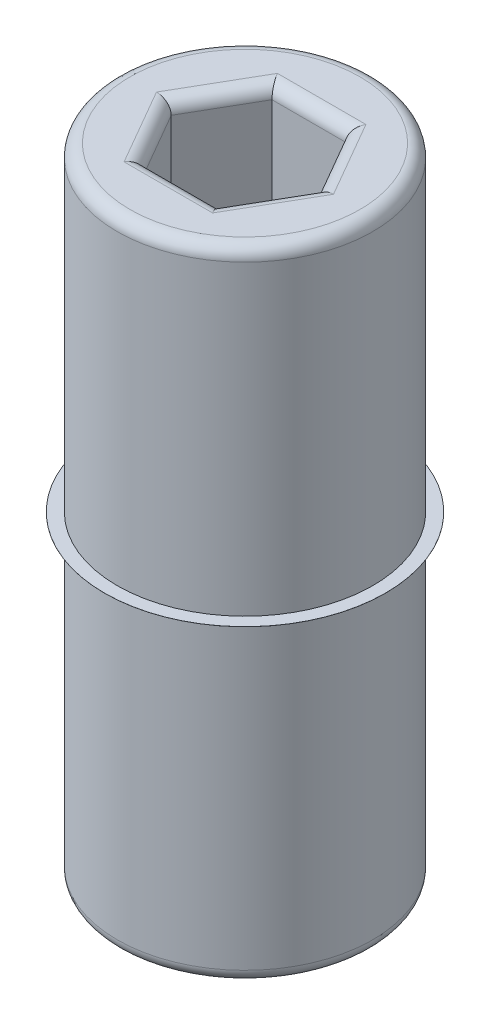
ISO-10303-21;
HEADER;
FILE_DESCRIPTION(('STEP AP214'),'2;1');
FILE_NAME('part.step','',(''),(''),'','','');
FILE_SCHEMA(('AUTOMOTIVE_DESIGN { 1 0 10303 214 1 1 1 1 }'));
ENDSEC;
DATA;
#1=APPLICATION_CONTEXT('core data for automotive mechanical design processes');
#2=APPLICATION_PROTOCOL_DEFINITION('international standard','automotive_design',2000,#1);
#3=PRODUCT_CONTEXT('',#1,'mechanical');
#4=PRODUCT('Part','Part','',(#3));
#5=PRODUCT_RELATED_PRODUCT_CATEGORY('part','',(#4));
#6=PRODUCT_DEFINITION_FORMATION('','',#4);
#7=PRODUCT_DEFINITION_CONTEXT('part definition',#1,'design');
#8=PRODUCT_DEFINITION('design','',#6,#7);
#9=PRODUCT_DEFINITION_SHAPE('','',#8);
#10=(LENGTH_UNIT() NAMED_UNIT(*) SI_UNIT(.MILLI.,.METRE.));
#11=(NAMED_UNIT(*) PLANE_ANGLE_UNIT() SI_UNIT($,.RADIAN.));
#12=(NAMED_UNIT(*) SI_UNIT($,.STERADIAN.) SOLID_ANGLE_UNIT());
#13=UNCERTAINTY_MEASURE_WITH_UNIT(LENGTH_MEASURE(1.E-05),#10,'distance_accuracy_value','');
#14=(GEOMETRIC_REPRESENTATION_CONTEXT(3) GLOBAL_UNCERTAINTY_ASSIGNED_CONTEXT((#13)) GLOBAL_UNIT_ASSIGNED_CONTEXT((#10,
#11,#12)) REPRESENTATION_CONTEXT('',''));
#15=CARTESIAN_POINT('',(0.,0.,0.));
#16=DIRECTION('',(0.,0.,1.));
#17=DIRECTION('',(1.,0.,0.));
#18=AXIS2_PLACEMENT_3D('',#15,#16,#17);
#19=CARTESIAN_POINT('',(0.,5.,0.));
#20=DIRECTION('',(0.,-1.,0.));
#21=DIRECTION('',(0.,0.,-1.));
#22=AXIS2_PLACEMENT_3D('',#19,#20,#21);
#23=CYLINDRICAL_SURFACE('',#22,2.);
#24=CARTESIAN_POINT('',(0.,0.000499999999999633,0.));
#25=DIRECTION('',(0.,1.,0.));
#26=DIRECTION('',(0.,0.,1.));
#27=AXIS2_PLACEMENT_3D('',#24,#25,#26);
#28=CIRCLE('',#27,2.);
#29=CARTESIAN_POINT('',(0.,0.000499999999999633,2.));
#30=VERTEX_POINT('',#29);
#31=EDGE_CURVE('E40',#30,#30,#28,.T.);
#32=ORIENTED_EDGE('',*,*,#31,.T.);
#33=EDGE_LOOP('',(#32));
#34=FACE_BOUND('',#33,.T.);
#35=CARTESIAN_POINT('',(0.,4.8,0.));
#36=DIRECTION('',(0.,1.,0.));
#37=DIRECTION('',(0.,0.,1.));
#38=AXIS2_PLACEMENT_3D('',#35,#36,#37);
#39=CIRCLE('',#38,2.);
#40=CARTESIAN_POINT('',(0.,4.8,2.));
#41=VERTEX_POINT('',#40);
#42=EDGE_CURVE('E186',#41,#41,#39,.F.);
#43=ORIENTED_EDGE('',*,*,#42,.T.);
#44=EDGE_LOOP('',(#43));
#45=FACE_BOUND('',#44,.T.);
#46=ADVANCED_FACE('F36',(#34,#45),#23,.T.);
#47=CARTESIAN_POINT('',(0.,5.,0.));
#48=DIRECTION('',(0.,1.,0.));
#49=DIRECTION('',(0.,0.,1.));
#50=AXIS2_PLACEMENT_3D('',#47,#48,#49);
#51=PLANE('',#50);
#52=DIRECTION('',(1.,0.,0.));
#53=VECTOR('',#52,1.);
#54=CARTESIAN_POINT('',(-0.577350269189626,5.,1.2));
#55=LINE('',#54,#53);
#56=CARTESIAN_POINT('',(0.692820323027551,5.,1.2));
#57=VERTEX_POINT('',#56);
#58=CARTESIAN_POINT('',(-0.692820323027551,5.,1.2));
#59=VERTEX_POINT('',#58);
#60=EDGE_CURVE('E175',#57,#59,#55,.F.);
#61=ORIENTED_EDGE('',*,*,#60,.T.);
#62=DIRECTION('',(0.5,0.,0.866025403784439));
#63=VECTOR('',#62,1.);
#64=CARTESIAN_POINT('',(-1.32790561913614,5.,0.0999999999999996));
#65=LINE('',#64,#63);
#66=CARTESIAN_POINT('',(-1.3856406460551,5.,0.));
#67=VERTEX_POINT('',#66);
#68=EDGE_CURVE('E177',#59,#67,#65,.F.);
#69=ORIENTED_EDGE('',*,*,#68,.T.);
#70=DIRECTION('',(-0.5,0.,0.866025403784439));
#71=VECTOR('',#70,1.);
#72=CARTESIAN_POINT('',(-0.750555349946513,5.,-1.1));
#73=LINE('',#72,#71);
#74=CARTESIAN_POINT('',(-0.692820323027551,5.,-1.2));
#75=VERTEX_POINT('',#74);
#76=EDGE_CURVE('E168',#67,#75,#73,.F.);
#77=ORIENTED_EDGE('',*,*,#76,.T.);
#78=DIRECTION('',(-1.,0.,0.));
#79=VECTOR('',#78,1.);
#80=CARTESIAN_POINT('',(0.577350269189626,5.,-1.2));
#81=LINE('',#80,#79);
#82=CARTESIAN_POINT('',(0.692820323027551,5.,-1.2));
#83=VERTEX_POINT('',#82);
#84=EDGE_CURVE('E166',#75,#83,#81,.F.);
#85=ORIENTED_EDGE('',*,*,#84,.T.);
#86=DIRECTION('',(-0.5,0.,-0.866025403784439));
#87=VECTOR('',#86,1.);
#88=CARTESIAN_POINT('',(1.32790561913614,5.,-0.1));
#89=LINE('',#88,#87);
#90=CARTESIAN_POINT('',(1.3856406460551,5.,0.));
#91=VERTEX_POINT('',#90);
#92=EDGE_CURVE('E170',#83,#91,#89,.F.);
#93=ORIENTED_EDGE('',*,*,#92,.T.);
#94=DIRECTION('',(0.5,0.,-0.866025403784439));
#95=VECTOR('',#94,1.);
#96=CARTESIAN_POINT('',(0.750555349946514,5.,1.1));
#97=LINE('',#96,#95);
#98=EDGE_CURVE('E173',#91,#57,#97,.F.);
#99=ORIENTED_EDGE('',*,*,#98,.T.);
#100=EDGE_LOOP('',(#61,#69,#77,#85,#93,#99));
#101=FACE_BOUND('',#100,.T.);
#102=CARTESIAN_POINT('',(0.,5.,0.));
#103=DIRECTION('',(0.,1.,0.));
#104=DIRECTION('',(0.,0.,1.));
#105=AXIS2_PLACEMENT_3D('',#102,#103,#104);
#106=CIRCLE('',#105,1.8);
#107=CARTESIAN_POINT('',(0.,5.,1.8));
#108=VERTEX_POINT('',#107);
#109=EDGE_CURVE('E163',#108,#108,#106,.T.);
#110=ORIENTED_EDGE('',*,*,#109,.T.);
#111=EDGE_LOOP('',(#110));
#112=FACE_BOUND('',#111,.T.);
#113=ADVANCED_FACE('F243',(#101,#112),#51,.T.);
#114=CARTESIAN_POINT('',(0.577350269189626,3.25,1.));
#115=DIRECTION('',(0.866025403784439,0.,0.5));
#116=DIRECTION('',(0.5,0.,-0.866025403784439));
#117=AXIS2_PLACEMENT_3D('',#114,#115,#116);
#118=PLANE('',#117);
#119=DIRECTION('',(0.,1.,0.));
#120=VECTOR('',#119,1.);
#121=CARTESIAN_POINT('',(0.577350269189626,3.25,1.));
#122=LINE('',#121,#120);
#123=CARTESIAN_POINT('',(0.577350269189626,3.25,1.));
#124=VERTEX_POINT('',#123);
#125=CARTESIAN_POINT('',(0.577350269189626,4.8,1.));
#126=VERTEX_POINT('',#125);
#127=EDGE_CURVE('E151',#124,#126,#122,.T.);
#128=ORIENTED_EDGE('',*,*,#127,.T.);
#129=DIRECTION('',(0.5,0.,-0.866025403784439));
#130=VECTOR('',#129,1.);
#131=CARTESIAN_POINT('',(1.15470053837925,4.8,0.));
#132=LINE('',#131,#130);
#133=CARTESIAN_POINT('',(1.15470053837925,4.8,0.));
#134=VERTEX_POINT('',#133);
#135=EDGE_CURVE('E116',#126,#134,#132,.T.);
#136=ORIENTED_EDGE('',*,*,#135,.T.);
#137=DIRECTION('',(0.,1.,0.));
#138=VECTOR('',#137,1.);
#139=CARTESIAN_POINT('',(1.15470053837925,3.25,0.));
#140=LINE('',#139,#138);
#141=CARTESIAN_POINT('',(1.15470053837925,3.25,0.));
#142=VERTEX_POINT('',#141);
#143=EDGE_CURVE('E109',#142,#134,#140,.T.);
#144=ORIENTED_EDGE('',*,*,#143,.F.);
#145=DIRECTION('',(0.5,0.,-0.866025403784439));
#146=VECTOR('',#145,1.);
#147=CARTESIAN_POINT('',(0.577350269189626,3.25,1.));
#148=LINE('',#147,#146);
#149=EDGE_CURVE('E113',#124,#142,#148,.T.);
#150=ORIENTED_EDGE('',*,*,#149,.F.);
#151=EDGE_LOOP('',(#128,#136,#144,#150));
#152=FACE_BOUND('',#151,.T.);
#153=ADVANCED_FACE('F111',(#152),#118,.F.);
#154=CARTESIAN_POINT('',(-0.577350269189626,3.25,1.));
#155=DIRECTION('',(0.,0.,1.));
#156=DIRECTION('',(1.,0.,0.));
#157=AXIS2_PLACEMENT_3D('',#154,#155,#156);
#158=PLANE('',#157);
#159=DIRECTION('',(0.,1.,0.));
#160=VECTOR('',#159,1.);
#161=CARTESIAN_POINT('',(-0.577350269189626,3.25,1.));
#162=LINE('',#161,#160);
#163=CARTESIAN_POINT('',(-0.577350269189626,3.25,1.));
#164=VERTEX_POINT('',#163);
#165=CARTESIAN_POINT('',(-0.577350269189626,4.8,1.));
#166=VERTEX_POINT('',#165);
#167=EDGE_CURVE('E154',#164,#166,#162,.T.);
#168=ORIENTED_EDGE('',*,*,#167,.T.);
#169=DIRECTION('',(1.,0.,0.));
#170=VECTOR('',#169,1.);
#171=CARTESIAN_POINT('',(0.577350269189626,4.8,1.));
#172=LINE('',#171,#170);
#173=EDGE_CURVE('E52',#166,#126,#172,.T.);
#174=ORIENTED_EDGE('',*,*,#173,.T.);
#175=ORIENTED_EDGE('',*,*,#127,.F.);
#176=DIRECTION('',(1.,0.,0.));
#177=VECTOR('',#176,1.);
#178=CARTESIAN_POINT('',(-0.577350269189626,3.25,1.));
#179=LINE('',#178,#177);
#180=EDGE_CURVE('E121',#164,#124,#179,.T.);
#181=ORIENTED_EDGE('',*,*,#180,.F.);
#182=EDGE_LOOP('',(#168,#174,#175,#181));
#183=FACE_BOUND('',#182,.T.);
#184=ADVANCED_FACE('F235',(#183),#158,.F.);
#185=CARTESIAN_POINT('',(-1.15470053837925,3.25,0.));
#186=DIRECTION('',(-0.866025403784439,0.,0.5));
#187=DIRECTION('',(0.5,0.,0.866025403784439));
#188=AXIS2_PLACEMENT_3D('',#185,#186,#187);
#189=PLANE('',#188);
#190=DIRECTION('',(0.,1.,0.));
#191=VECTOR('',#190,1.);
#192=CARTESIAN_POINT('',(-1.15470053837925,3.25,0.));
#193=LINE('',#192,#191);
#194=CARTESIAN_POINT('',(-1.15470053837925,3.25,0.));
#195=VERTEX_POINT('',#194);
#196=CARTESIAN_POINT('',(-1.15470053837925,4.8,0.));
#197=VERTEX_POINT('',#196);
#198=EDGE_CURVE('E156',#195,#197,#193,.T.);
#199=ORIENTED_EDGE('',*,*,#198,.T.);
#200=DIRECTION('',(0.5,0.,0.866025403784439));
#201=VECTOR('',#200,1.);
#202=CARTESIAN_POINT('',(-0.577350269189626,4.8,1.));
#203=LINE('',#202,#201);
#204=EDGE_CURVE('E60',#197,#166,#203,.T.);
#205=ORIENTED_EDGE('',*,*,#204,.T.);
#206=ORIENTED_EDGE('',*,*,#167,.F.);
#207=DIRECTION('',(0.5,0.,0.866025403784439));
#208=VECTOR('',#207,1.);
#209=CARTESIAN_POINT('',(-1.15470053837925,3.25,0.));
#210=LINE('',#209,#208);
#211=EDGE_CURVE('E148',#195,#164,#210,.T.);
#212=ORIENTED_EDGE('',*,*,#211,.F.);
#213=EDGE_LOOP('',(#199,#205,#206,#212));
#214=FACE_BOUND('',#213,.T.);
#215=ADVANCED_FACE('F234',(#214),#189,.F.);
#216=CARTESIAN_POINT('',(-0.577350269189626,3.25,-1.));
#217=DIRECTION('',(-0.866025403784438,0.,-0.5));
#218=DIRECTION('',(-0.5,0.,0.866025403784439));
#219=AXIS2_PLACEMENT_3D('',#216,#217,#218);
#220=PLANE('',#219);
#221=DIRECTION('',(0.,1.,0.));
#222=VECTOR('',#221,1.);
#223=CARTESIAN_POINT('',(-0.577350269189626,3.25,-1.));
#224=LINE('',#223,#222);
#225=CARTESIAN_POINT('',(-0.577350269189626,3.25,-1.));
#226=VERTEX_POINT('',#225);
#227=CARTESIAN_POINT('',(-0.577350269189626,4.8,-1.));
#228=VERTEX_POINT('',#227);
#229=EDGE_CURVE('E158',#226,#228,#224,.T.);
#230=ORIENTED_EDGE('',*,*,#229,.T.);
#231=DIRECTION('',(-0.5,0.,0.866025403784439));
#232=VECTOR('',#231,1.);
#233=CARTESIAN_POINT('',(-1.15470053837925,4.8,0.));
#234=LINE('',#233,#232);
#235=EDGE_CURVE('E179',#228,#197,#234,.T.);
#236=ORIENTED_EDGE('',*,*,#235,.T.);
#237=ORIENTED_EDGE('',*,*,#198,.F.);
#238=DIRECTION('',(-0.5,0.,0.866025403784439));
#239=VECTOR('',#238,1.);
#240=CARTESIAN_POINT('',(-0.577350269189626,3.25,-1.));
#241=LINE('',#240,#239);
#242=EDGE_CURVE('E145',#226,#195,#241,.T.);
#243=ORIENTED_EDGE('',*,*,#242,.F.);
#244=EDGE_LOOP('',(#230,#236,#237,#243));
#245=FACE_BOUND('',#244,.T.);
#246=ADVANCED_FACE('F233',(#245),#220,.F.);
#247=CARTESIAN_POINT('',(0.577350269189626,3.25,-1.));
#248=DIRECTION('',(0.,0.,-1.));
#249=DIRECTION('',(-1.,0.,0.));
#250=AXIS2_PLACEMENT_3D('',#247,#248,#249);
#251=PLANE('',#250);
#252=DIRECTION('',(0.,1.,0.));
#253=VECTOR('',#252,1.);
#254=CARTESIAN_POINT('',(0.577350269189626,3.25,-1.));
#255=LINE('',#254,#253);
#256=CARTESIAN_POINT('',(0.577350269189626,3.25,-1.));
#257=VERTEX_POINT('',#256);
#258=CARTESIAN_POINT('',(0.577350269189626,4.8,-1.));
#259=VERTEX_POINT('',#258);
#260=EDGE_CURVE('E120',#257,#259,#255,.T.);
#261=ORIENTED_EDGE('',*,*,#260,.T.);
#262=DIRECTION('',(-1.,0.,0.));
#263=VECTOR('',#262,1.);
#264=CARTESIAN_POINT('',(-0.577350269189626,4.8,-1.));
#265=LINE('',#264,#263);
#266=EDGE_CURVE('E184',#259,#228,#265,.T.);
#267=ORIENTED_EDGE('',*,*,#266,.T.);
#268=ORIENTED_EDGE('',*,*,#229,.F.);
#269=DIRECTION('',(-1.,0.,0.));
#270=VECTOR('',#269,1.);
#271=CARTESIAN_POINT('',(0.577350269189626,3.25,-1.));
#272=LINE('',#271,#270);
#273=EDGE_CURVE('E130',#257,#226,#272,.T.);
#274=ORIENTED_EDGE('',*,*,#273,.F.);
#275=EDGE_LOOP('',(#261,#267,#268,#274));
#276=FACE_BOUND('',#275,.T.);
#277=ADVANCED_FACE('F229',(#276),#251,.F.);
#278=CARTESIAN_POINT('',(1.15470053837925,3.25,0.));
#279=DIRECTION('',(0.866025403784439,0.,-0.5));
#280=DIRECTION('',(-0.5,0.,-0.866025403784439));
#281=AXIS2_PLACEMENT_3D('',#278,#279,#280);
#282=PLANE('',#281);
#283=ORIENTED_EDGE('',*,*,#143,.T.);
#284=DIRECTION('',(-0.5,0.,-0.866025403784439));
#285=VECTOR('',#284,1.);
#286=CARTESIAN_POINT('',(0.577350269189626,4.8,-1.));
#287=LINE('',#286,#285);
#288=EDGE_CURVE('E153',#134,#259,#287,.T.);
#289=ORIENTED_EDGE('',*,*,#288,.T.);
#290=ORIENTED_EDGE('',*,*,#260,.F.);
#291=DIRECTION('',(-0.5,0.,-0.866025403784439));
#292=VECTOR('',#291,1.);
#293=CARTESIAN_POINT('',(1.15470053837925,3.25,0.));
#294=LINE('',#293,#292);
#295=EDGE_CURVE('E124',#142,#257,#294,.T.);
#296=ORIENTED_EDGE('',*,*,#295,.F.);
#297=EDGE_LOOP('',(#283,#289,#290,#296));
#298=FACE_BOUND('',#297,.T.);
#299=ADVANCED_FACE('F125',(#298),#282,.F.);
#300=CARTESIAN_POINT('',(0.,3.25,0.));
#301=DIRECTION('',(0.,1.,0.));
#302=DIRECTION('',(0.,0.,1.));
#303=AXIS2_PLACEMENT_3D('',#300,#301,#302);
#304=PLANE('',#303);
#305=ORIENTED_EDGE('',*,*,#149,.T.);
#306=ORIENTED_EDGE('',*,*,#295,.T.);
#307=ORIENTED_EDGE('',*,*,#273,.T.);
#308=ORIENTED_EDGE('',*,*,#242,.T.);
#309=ORIENTED_EDGE('',*,*,#211,.T.);
#310=ORIENTED_EDGE('',*,*,#180,.T.);
#311=EDGE_LOOP('',(#305,#306,#307,#308,#309,#310));
#312=FACE_BOUND('',#311,.T.);
#313=ADVANCED_FACE('F132',(#312),#304,.T.);
#314=CARTESIAN_POINT('',(-1.32790561913614,4.8,0.0999999999999996));
#315=DIRECTION('',(-0.5,0.,-0.866025403784439));
#316=DIRECTION('',(-0.866025403784439,0.,0.5));
#317=AXIS2_PLACEMENT_3D('',#314,#315,#316);
#318=CYLINDRICAL_SURFACE('',#317,0.2);
#319=CARTESIAN_POINT('',(-1.3856406460551,4.8,0.));
#320=DIRECTION('',(0.,0.,-1.));
#321=DIRECTION('',(1.,0.,0.));
#322=AXIS2_PLACEMENT_3D('',#319,#320,#321);
#323=ELLIPSE('',#322,0.23094010767585,0.2);
#324=EDGE_CURVE('E138',#67,#197,#323,.T.);
#325=ORIENTED_EDGE('',*,*,#324,.F.);
#326=ORIENTED_EDGE('',*,*,#68,.F.);
#327=CARTESIAN_POINT('',(-0.692820323027551,4.8,1.2));
#328=DIRECTION('',(-0.866025403784438,0.,-0.5));
#329=DIRECTION('',(0.5,0.,-0.866025403784439));
#330=AXIS2_PLACEMENT_3D('',#327,#328,#329);
#331=ELLIPSE('',#330,0.23094010767585,0.2);
#332=EDGE_CURVE('E135',#166,#59,#331,.F.);
#333=ORIENTED_EDGE('',*,*,#332,.F.);
#334=ORIENTED_EDGE('',*,*,#204,.F.);
#335=EDGE_LOOP('',(#325,#326,#333,#334));
#336=FACE_BOUND('',#335,.T.);
#337=ADVANCED_FACE('F213',(#336),#318,.T.);
#338=CARTESIAN_POINT('',(-0.577350269189626,4.8,1.2));
#339=DIRECTION('',(-1.,0.,0.));
#340=DIRECTION('',(0.,0.,1.));
#341=AXIS2_PLACEMENT_3D('',#338,#339,#340);
#342=CYLINDRICAL_SURFACE('',#341,0.2);
#343=ORIENTED_EDGE('',*,*,#332,.T.);
#344=ORIENTED_EDGE('',*,*,#60,.F.);
#345=CARTESIAN_POINT('',(0.692820323027551,4.8,1.2));
#346=DIRECTION('',(-0.866025403784439,0.,0.5));
#347=DIRECTION('',(-0.5,0.,-0.866025403784439));
#348=AXIS2_PLACEMENT_3D('',#345,#346,#347);
#349=ELLIPSE('',#348,0.23094010767585,0.2);
#350=EDGE_CURVE('E201',#126,#57,#349,.F.);
#351=ORIENTED_EDGE('',*,*,#350,.F.);
#352=ORIENTED_EDGE('',*,*,#173,.F.);
#353=EDGE_LOOP('',(#343,#344,#351,#352));
#354=FACE_BOUND('',#353,.T.);
#355=ADVANCED_FACE('F218',(#354),#342,.T.);
#356=CARTESIAN_POINT('',(-0.750555349946513,4.8,-1.1));
#357=DIRECTION('',(0.5,0.,-0.866025403784439));
#358=DIRECTION('',(-0.866025403784438,0.,-0.5));
#359=AXIS2_PLACEMENT_3D('',#356,#357,#358);
#360=CYLINDRICAL_SURFACE('',#359,0.2);
#361=ORIENTED_EDGE('',*,*,#324,.T.);
#362=ORIENTED_EDGE('',*,*,#235,.F.);
#363=CARTESIAN_POINT('',(-0.692820323027551,4.8,-1.2));
#364=DIRECTION('',(0.866025403784439,0.,-0.5));
#365=DIRECTION('',(-0.5,0.,-0.866025403784439));
#366=AXIS2_PLACEMENT_3D('',#363,#364,#365);
#367=ELLIPSE('',#366,0.23094010767585,0.2);
#368=EDGE_CURVE('E198',#75,#228,#367,.T.);
#369=ORIENTED_EDGE('',*,*,#368,.F.);
#370=ORIENTED_EDGE('',*,*,#76,.F.);
#371=EDGE_LOOP('',(#361,#362,#369,#370));
#372=FACE_BOUND('',#371,.T.);
#373=ADVANCED_FACE('F209',(#372),#360,.T.);
#374=CARTESIAN_POINT('',(0.750555349946514,4.8,1.1));
#375=DIRECTION('',(-0.5,0.,0.866025403784439));
#376=DIRECTION('',(0.866025403784439,0.,0.5));
#377=AXIS2_PLACEMENT_3D('',#374,#375,#376);
#378=CYLINDRICAL_SURFACE('',#377,0.2);
#379=ORIENTED_EDGE('',*,*,#350,.T.);
#380=ORIENTED_EDGE('',*,*,#98,.F.);
#381=CARTESIAN_POINT('',(1.3856406460551,4.8,0.));
#382=DIRECTION('',(0.,0.,1.));
#383=DIRECTION('',(1.,0.,0.));
#384=AXIS2_PLACEMENT_3D('',#381,#382,#383);
#385=ELLIPSE('',#384,0.23094010767585,0.2);
#386=EDGE_CURVE('E196',#134,#91,#385,.F.);
#387=ORIENTED_EDGE('',*,*,#386,.F.);
#388=ORIENTED_EDGE('',*,*,#135,.F.);
#389=EDGE_LOOP('',(#379,#380,#387,#388));
#390=FACE_BOUND('',#389,.T.);
#391=ADVANCED_FACE('F221',(#390),#378,.T.);
#392=CARTESIAN_POINT('',(0.577350269189626,4.8,-1.2));
#393=DIRECTION('',(1.,0.,0.));
#394=DIRECTION('',(0.,0.,-1.));
#395=AXIS2_PLACEMENT_3D('',#392,#393,#394);
#396=CYLINDRICAL_SURFACE('',#395,0.2);
#397=ORIENTED_EDGE('',*,*,#368,.T.);
#398=ORIENTED_EDGE('',*,*,#266,.F.);
#399=CARTESIAN_POINT('',(0.692820323027551,4.8,-1.2));
#400=DIRECTION('',(0.866025403784438,0.,0.5));
#401=DIRECTION('',(-0.5,0.,0.866025403784438));
#402=AXIS2_PLACEMENT_3D('',#399,#400,#401);
#403=ELLIPSE('',#402,0.23094010767585,0.2);
#404=EDGE_CURVE('E194',#83,#259,#403,.T.);
#405=ORIENTED_EDGE('',*,*,#404,.F.);
#406=ORIENTED_EDGE('',*,*,#84,.F.);
#407=EDGE_LOOP('',(#397,#398,#405,#406));
#408=FACE_BOUND('',#407,.T.);
#409=ADVANCED_FACE('F421',(#408),#396,.T.);
#410=CARTESIAN_POINT('',(1.32790561913614,4.8,-0.1));
#411=DIRECTION('',(0.5,0.,0.866025403784439));
#412=DIRECTION('',(0.866025403784439,0.,-0.5));
#413=AXIS2_PLACEMENT_3D('',#410,#411,#412);
#414=CYLINDRICAL_SURFACE('',#413,0.2);
#415=ORIENTED_EDGE('',*,*,#386,.T.);
#416=ORIENTED_EDGE('',*,*,#92,.F.);
#417=ORIENTED_EDGE('',*,*,#404,.T.);
#418=ORIENTED_EDGE('',*,*,#288,.F.);
#419=EDGE_LOOP('',(#415,#416,#417,#418));
#420=FACE_BOUND('',#419,.T.);
#421=ADVANCED_FACE('F225',(#420),#414,.T.);
#422=CARTESIAN_POINT('',(0.,4.8,0.));
#423=DIRECTION('',(0.,1.,0.));
#424=DIRECTION('',(0.,0.,1.));
#425=AXIS2_PLACEMENT_3D('',#422,#423,#424);
#426=TOROIDAL_SURFACE('',#425,1.8,0.2);
#427=ORIENTED_EDGE('',*,*,#42,.F.);
#428=EDGE_LOOP('',(#427));
#429=FACE_BOUND('',#428,.T.);
#430=ORIENTED_EDGE('',*,*,#109,.F.);
#431=EDGE_LOOP('',(#430));
#432=FACE_BOUND('',#431,.T.);
#433=ADVANCED_FACE('F38',(#429,#432),#426,.T.);
#434=CARTESIAN_POINT('',(0.,0.0005,0.));
#435=DIRECTION('',(0.,-1.,0.));
#436=DIRECTION('',(0.,0.,-1.));
#437=AXIS2_PLACEMENT_3D('',#434,#435,#436);
#438=CYLINDRICAL_SURFACE('',#437,2.2);
#439=CARTESIAN_POINT('',(0.,0.0005,0.));
#440=DIRECTION('',(0.,1.,0.));
#441=DIRECTION('',(0.,0.,1.));
#442=AXIS2_PLACEMENT_3D('',#439,#440,#441);
#443=CIRCLE('',#442,2.2);
#444=CARTESIAN_POINT('',(0.,0.0005,2.2));
#445=VERTEX_POINT('',#444);
#446=EDGE_CURVE('E279',#445,#445,#443,.T.);
#447=ORIENTED_EDGE('',*,*,#446,.F.);
#448=EDGE_LOOP('',(#447));
#449=FACE_BOUND('',#448,.T.);
#450=CARTESIAN_POINT('',(0.,-0.0005,0.));
#451=DIRECTION('',(0.,1.,0.));
#452=DIRECTION('',(0.,0.,1.));
#453=AXIS2_PLACEMENT_3D('',#450,#451,#452);
#454=CIRCLE('',#453,2.2);
#455=CARTESIAN_POINT('',(0.,-0.0005,2.2));
#456=VERTEX_POINT('',#455);
#457=EDGE_CURVE('E141',#456,#456,#454,.T.);
#458=ORIENTED_EDGE('',*,*,#457,.T.);
#459=EDGE_LOOP('',(#458));
#460=FACE_BOUND('',#459,.T.);
#461=ADVANCED_FACE('F286',(#449,#460),#438,.T.);
#462=CARTESIAN_POINT('',(0.,0.0005,0.));
#463=DIRECTION('',(0.,1.,0.));
#464=DIRECTION('',(0.,0.,1.));
#465=AXIS2_PLACEMENT_3D('',#462,#463,#464);
#466=PLANE('',#465);
#467=ORIENTED_EDGE('',*,*,#31,.F.);
#468=EDGE_LOOP('',(#467));
#469=FACE_BOUND('',#468,.T.);
#470=ORIENTED_EDGE('',*,*,#446,.T.);
#471=EDGE_LOOP('',(#470));
#472=FACE_BOUND('',#471,.T.);
#473=ADVANCED_FACE('F274',(#469,#472),#466,.T.);
#474=CARTESIAN_POINT('',(0.,-0.0005,0.));
#475=DIRECTION('',(0.,1.,0.));
#476=DIRECTION('',(0.,0.,1.));
#477=AXIS2_PLACEMENT_3D('',#474,#475,#476);
#478=PLANE('',#477);
#479=CARTESIAN_POINT('',(0.,-0.000499999999999633,0.));
#480=DIRECTION('',(0.,1.,0.));
#481=DIRECTION('',(0.,0.,1.));
#482=AXIS2_PLACEMENT_3D('',#479,#480,#481);
#483=CIRCLE('',#482,2.);
#484=CARTESIAN_POINT('',(0.,-0.000499999999999633,2.));
#485=VERTEX_POINT('',#484);
#486=EDGE_CURVE('E11',#485,#485,#483,.T.);
#487=ORIENTED_EDGE('',*,*,#486,.T.);
#488=EDGE_LOOP('',(#487));
#489=FACE_BOUND('',#488,.T.);
#490=ORIENTED_EDGE('',*,*,#457,.F.);
#491=EDGE_LOOP('',(#490));
#492=FACE_BOUND('',#491,.T.);
#493=ADVANCED_FACE('F271',(#489,#492),#478,.F.);
#494=CARTESIAN_POINT('',(0.,-5.,0.));
#495=DIRECTION('',(0.,1.,0.));
#496=DIRECTION('',(0.,0.,1.));
#497=AXIS2_PLACEMENT_3D('',#494,#495,#496);
#498=PLANE('',#497);
#499=CARTESIAN_POINT('',(0.,-5.,0.));
#500=DIRECTION('',(0.,1.,0.));
#501=DIRECTION('',(0.,0.,1.));
#502=AXIS2_PLACEMENT_3D('',#499,#500,#501);
#503=CIRCLE('',#502,1.8);
#504=CARTESIAN_POINT('',(0.,-5.,1.8));
#505=VERTEX_POINT('',#504);
#506=EDGE_CURVE('E45',#505,#505,#503,.F.);
#507=ORIENTED_EDGE('',*,*,#506,.T.);
#508=EDGE_LOOP('',(#507));
#509=FACE_BOUND('',#508,.T.);
#510=ADVANCED_FACE('F265',(#509),#498,.F.);
#511=CARTESIAN_POINT('',(0.,-4.8,0.));
#512=DIRECTION('',(0.,1.,0.));
#513=DIRECTION('',(0.,0.,1.));
#514=AXIS2_PLACEMENT_3D('',#511,#512,#513);
#515=TOROIDAL_SURFACE('',#514,1.8,0.2);
#516=ORIENTED_EDGE('',*,*,#506,.F.);
#517=EDGE_LOOP('',(#516));
#518=FACE_BOUND('',#517,.T.);
#519=CARTESIAN_POINT('',(0.,-4.8,0.));
#520=DIRECTION('',(0.,1.,0.));
#521=DIRECTION('',(0.,0.,1.));
#522=AXIS2_PLACEMENT_3D('',#519,#520,#521);
#523=CIRCLE('',#522,2.);
#524=CARTESIAN_POINT('',(0.,-4.8,2.));
#525=VERTEX_POINT('',#524);
#526=EDGE_CURVE('E189',#525,#525,#523,.T.);
#527=ORIENTED_EDGE('',*,*,#526,.F.);
#528=EDGE_LOOP('',(#527));
#529=FACE_BOUND('',#528,.T.);
#530=ADVANCED_FACE('F260',(#518,#529),#515,.T.);
#531=ORIENTED_EDGE('',*,*,#526,.T.);
#532=EDGE_LOOP('',(#531));
#533=FACE_BOUND('',#532,.T.);
#534=ORIENTED_EDGE('',*,*,#486,.F.);
#535=EDGE_LOOP('',(#534));
#536=FACE_BOUND('',#535,.T.);
#537=ADVANCED_FACE('F249',(#533,#536),#23,.T.);
#538=CLOSED_SHELL('',(#46,#113,#153,#184,#215,#246,#277,#299,#313,#337,#355,#373,#391,#409,#421,
#433,#461,#473,#493,#510,#530,#537));
#539=MANIFOLD_SOLID_BREP('B2',#538);
#540=ADVANCED_BREP_SHAPE_REPRESENTATION('',(#18,#539),#14);
#541=SHAPE_DEFINITION_REPRESENTATION(#9,#540);
ENDSEC;
END-ISO-10303-21;
